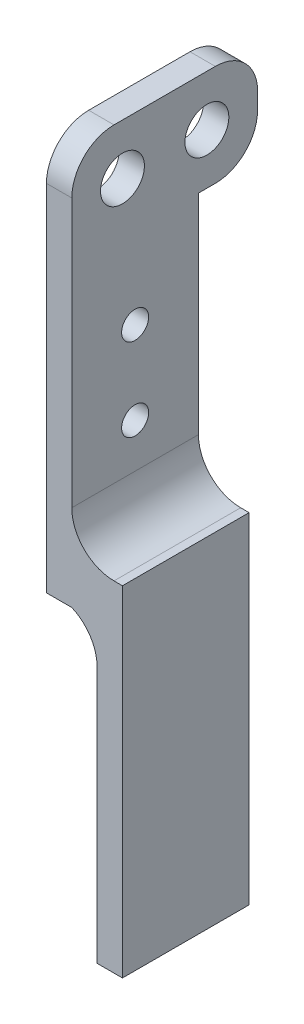
ISO-10303-21;
HEADER;
FILE_DESCRIPTION(('STEP AP214'),'2;1');
FILE_NAME('part.step','',(''),(''),'','','');
FILE_SCHEMA(('AUTOMOTIVE_DESIGN { 1 0 10303 214 1 1 1 1 }'));
ENDSEC;
DATA;
#1=APPLICATION_CONTEXT('core data for automotive mechanical design processes');
#2=APPLICATION_PROTOCOL_DEFINITION('international standard','automotive_design',2000,#1);
#3=PRODUCT_CONTEXT('',#1,'mechanical');
#4=PRODUCT('Part','Part','',(#3));
#5=PRODUCT_RELATED_PRODUCT_CATEGORY('part','',(#4));
#6=PRODUCT_DEFINITION_FORMATION('','',#4);
#7=PRODUCT_DEFINITION_CONTEXT('part definition',#1,'design');
#8=PRODUCT_DEFINITION('design','',#6,#7);
#9=PRODUCT_DEFINITION_SHAPE('','',#8);
#10=(LENGTH_UNIT() NAMED_UNIT(*) SI_UNIT(.MILLI.,.METRE.));
#11=(NAMED_UNIT(*) PLANE_ANGLE_UNIT() SI_UNIT($,.RADIAN.));
#12=(NAMED_UNIT(*) SI_UNIT($,.STERADIAN.) SOLID_ANGLE_UNIT());
#13=UNCERTAINTY_MEASURE_WITH_UNIT(LENGTH_MEASURE(1.E-05),#10,'distance_accuracy_value','');
#14=(GEOMETRIC_REPRESENTATION_CONTEXT(3) GLOBAL_UNCERTAINTY_ASSIGNED_CONTEXT((#13)) GLOBAL_UNIT_ASSIGNED_CONTEXT((#10,
#11,#12)) REPRESENTATION_CONTEXT('',''));
#15=CARTESIAN_POINT('',(0.,0.,0.));
#16=DIRECTION('',(0.,0.,1.));
#17=DIRECTION('',(1.,0.,0.));
#18=AXIS2_PLACEMENT_3D('',#15,#16,#17);
#19=CARTESIAN_POINT('',(3.,0.,0.));
#20=DIRECTION('',(-1.,0.,0.));
#21=DIRECTION('',(0.,0.,1.));
#22=AXIS2_PLACEMENT_3D('',#19,#20,#21);
#23=PLANE('',#22);
#24=CARTESIAN_POINT('',(3.,0.,-10.));
#25=DIRECTION('',(1.,0.,0.));
#26=DIRECTION('',(0.,0.,-1.));
#27=AXIS2_PLACEMENT_3D('',#24,#25,#26);
#28=CIRCLE('',#27,2.6);
#29=CARTESIAN_POINT('',(3.,0.,-12.6));
#30=VERTEX_POINT('',#29);
#31=EDGE_CURVE('E257',#30,#30,#28,.T.);
#32=ORIENTED_EDGE('',*,*,#31,.F.);
#33=EDGE_LOOP('',(#32));
#34=FACE_BOUND('',#33,.T.);
#35=CARTESIAN_POINT('',(3.,0.,0.));
#36=DIRECTION('',(1.,0.,0.));
#37=DIRECTION('',(0.,0.,-1.));
#38=AXIS2_PLACEMENT_3D('',#35,#36,#37);
#39=CIRCLE('',#38,2.6);
#40=CARTESIAN_POINT('',(3.,0.,-2.6));
#41=VERTEX_POINT('',#40);
#42=EDGE_CURVE('E251',#41,#41,#39,.T.);
#43=ORIENTED_EDGE('',*,*,#42,.F.);
#44=EDGE_LOOP('',(#43));
#45=FACE_BOUND('',#44,.T.);
#46=CARTESIAN_POINT('',(3.,-25.55,-1.5));
#47=DIRECTION('',(1.,0.,0.));
#48=DIRECTION('',(0.,0.,-1.));
#49=AXIS2_PLACEMENT_3D('',#46,#47,#48);
#50=CIRCLE('',#49,1.6);
#51=CARTESIAN_POINT('',(3.,-25.55,-3.1));
#52=VERTEX_POINT('',#51);
#53=EDGE_CURVE('E234',#52,#52,#50,.T.);
#54=ORIENTED_EDGE('',*,*,#53,.F.);
#55=EDGE_LOOP('',(#54));
#56=FACE_BOUND('',#55,.T.);
#57=CARTESIAN_POINT('',(3.,-15.75,-1.5));
#58=DIRECTION('',(1.,0.,0.));
#59=DIRECTION('',(0.,0.,-1.));
#60=AXIS2_PLACEMENT_3D('',#57,#58,#59);
#61=CIRCLE('',#60,1.6);
#62=CARTESIAN_POINT('',(3.,-15.75,-3.10000000000001));
#63=VERTEX_POINT('',#62);
#64=EDGE_CURVE('E205',#63,#63,#61,.T.);
#65=ORIENTED_EDGE('',*,*,#64,.F.);
#66=EDGE_LOOP('',(#65));
#67=FACE_BOUND('',#66,.T.);
#68=DIRECTION('',(0.,-1.,0.));
#69=VECTOR('',#68,1.);
#70=CARTESIAN_POINT('',(3.,-6.,6.));
#71=LINE('',#70,#69);
#72=CARTESIAN_POINT('',(3.,1.,6.));
#73=VERTEX_POINT('',#72);
#74=CARTESIAN_POINT('',(3.,-30.77,6.));
#75=VERTEX_POINT('',#74);
#76=EDGE_CURVE('E267',#73,#75,#71,.T.);
#77=ORIENTED_EDGE('',*,*,#76,.T.);
#78=DIRECTION('',(0.,0.,1.));
#79=VECTOR('',#78,1.);
#80=CARTESIAN_POINT('',(3.,-30.77,-9.00000000000001));
#81=LINE('',#80,#79);
#82=CARTESIAN_POINT('',(3.,-30.77,-9.00000000000001));
#83=VERTEX_POINT('',#82);
#84=EDGE_CURVE('E53',#75,#83,#81,.F.);
#85=ORIENTED_EDGE('',*,*,#84,.T.);
#86=DIRECTION('',(0.,1.,0.));
#87=VECTOR('',#86,1.);
#88=CARTESIAN_POINT('',(3.,-6.,-9.00000000000001));
#89=LINE('',#88,#87);
#90=CARTESIAN_POINT('',(3.,-6.,-9.00000000000001));
#91=VERTEX_POINT('',#90);
#92=EDGE_CURVE('E244',#83,#91,#89,.T.);
#93=ORIENTED_EDGE('',*,*,#92,.T.);
#94=DIRECTION('',(0.,0.,-1.));
#95=VECTOR('',#94,1.);
#96=CARTESIAN_POINT('',(3.,-6.,6.));
#97=LINE('',#96,#95);
#98=CARTESIAN_POINT('',(3.,-6.,-11.));
#99=VERTEX_POINT('',#98);
#100=EDGE_CURVE('E176',#91,#99,#97,.T.);
#101=ORIENTED_EDGE('',*,*,#100,.T.);
#102=CARTESIAN_POINT('',(3.,-1.,-11.));
#103=DIRECTION('',(-1.,0.,0.));
#104=DIRECTION('',(0.,0.,1.));
#105=AXIS2_PLACEMENT_3D('',#102,#103,#104);
#106=CIRCLE('',#105,5.);
#107=CARTESIAN_POINT('',(3.,-1.,-16.));
#108=VERTEX_POINT('',#107);
#109=EDGE_CURVE('E189',#99,#108,#106,.F.);
#110=ORIENTED_EDGE('',*,*,#109,.T.);
#111=DIRECTION('',(0.,1.,0.));
#112=VECTOR('',#111,1.);
#113=CARTESIAN_POINT('',(3.,-6.,-16.));
#114=LINE('',#113,#112);
#115=CARTESIAN_POINT('',(3.,1.,-16.));
#116=VERTEX_POINT('',#115);
#117=EDGE_CURVE('E167',#108,#116,#114,.T.);
#118=ORIENTED_EDGE('',*,*,#117,.T.);
#119=CARTESIAN_POINT('',(3.,1.,-11.));
#120=DIRECTION('',(-1.,0.,0.));
#121=DIRECTION('',(0.,0.,1.));
#122=AXIS2_PLACEMENT_3D('',#119,#120,#121);
#123=CIRCLE('',#122,5.);
#124=CARTESIAN_POINT('',(3.,6.,-11.));
#125=VERTEX_POINT('',#124);
#126=EDGE_CURVE('E187',#116,#125,#123,.F.);
#127=ORIENTED_EDGE('',*,*,#126,.T.);
#128=DIRECTION('',(0.,0.,1.));
#129=VECTOR('',#128,1.);
#130=CARTESIAN_POINT('',(3.,6.,6.));
#131=LINE('',#130,#129);
#132=CARTESIAN_POINT('',(3.,6.,0.999999999999996));
#133=VERTEX_POINT('',#132);
#134=EDGE_CURVE('E264',#125,#133,#131,.T.);
#135=ORIENTED_EDGE('',*,*,#134,.T.);
#136=CARTESIAN_POINT('',(3.,1.,0.999999999999996));
#137=DIRECTION('',(-1.,0.,0.));
#138=DIRECTION('',(0.,0.,1.));
#139=AXIS2_PLACEMENT_3D('',#136,#137,#138);
#140=CIRCLE('',#139,5.);
#141=EDGE_CURVE('E191',#133,#73,#140,.F.);
#142=ORIENTED_EDGE('',*,*,#141,.T.);
#143=EDGE_LOOP('',(#77,#85,#93,#101,#110,#118,#127,#135,#142));
#144=FACE_BOUND('',#143,.T.);
#145=ADVANCED_FACE('F32',(#34,#45,#56,#67,#144),#23,.F.);
#146=CARTESIAN_POINT('',(0.,0.,0.));
#147=DIRECTION('',(-1.,0.,0.));
#148=DIRECTION('',(0.,0.,1.));
#149=AXIS2_PLACEMENT_3D('',#146,#147,#148);
#150=PLANE('',#149);
#151=DIRECTION('',(0.,0.,1.));
#152=VECTOR('',#151,1.);
#153=CARTESIAN_POINT('',(0.,-41.,6.));
#154=LINE('',#153,#152);
#155=CARTESIAN_POINT('',(0.,-41.,-9.00000000000001));
#156=VERTEX_POINT('',#155);
#157=CARTESIAN_POINT('',(0.,-41.,6.));
#158=VERTEX_POINT('',#157);
#159=EDGE_CURVE('E140',#156,#158,#154,.T.);
#160=ORIENTED_EDGE('',*,*,#159,.T.);
#161=DIRECTION('',(0.,-1.,0.));
#162=VECTOR('',#161,1.);
#163=CARTESIAN_POINT('',(0.,-6.,6.));
#164=LINE('',#163,#162);
#165=CARTESIAN_POINT('',(0.,1.,6.));
#166=VERTEX_POINT('',#165);
#167=EDGE_CURVE('E154',#166,#158,#164,.T.);
#168=ORIENTED_EDGE('',*,*,#167,.F.);
#169=CARTESIAN_POINT('',(0.,1.,0.999999999999996));
#170=DIRECTION('',(-1.,0.,0.));
#171=DIRECTION('',(0.,0.,1.));
#172=AXIS2_PLACEMENT_3D('',#169,#170,#171);
#173=CIRCLE('',#172,5.);
#174=CARTESIAN_POINT('',(0.,6.,0.999999999999996));
#175=VERTEX_POINT('',#174);
#176=EDGE_CURVE('E180',#166,#175,#173,.T.);
#177=ORIENTED_EDGE('',*,*,#176,.T.);
#178=DIRECTION('',(0.,0.,1.));
#179=VECTOR('',#178,1.);
#180=CARTESIAN_POINT('',(0.,6.,6.));
#181=LINE('',#180,#179);
#182=CARTESIAN_POINT('',(0.,6.,-11.));
#183=VERTEX_POINT('',#182);
#184=EDGE_CURVE('E164',#183,#175,#181,.T.);
#185=ORIENTED_EDGE('',*,*,#184,.F.);
#186=CARTESIAN_POINT('',(0.,1.,-11.));
#187=DIRECTION('',(-1.,0.,0.));
#188=DIRECTION('',(0.,0.,1.));
#189=AXIS2_PLACEMENT_3D('',#186,#187,#188);
#190=CIRCLE('',#189,5.);
#191=CARTESIAN_POINT('',(0.,1.,-16.));
#192=VERTEX_POINT('',#191);
#193=EDGE_CURVE('E175',#183,#192,#190,.T.);
#194=ORIENTED_EDGE('',*,*,#193,.T.);
#195=DIRECTION('',(0.,1.,0.));
#196=VECTOR('',#195,1.);
#197=CARTESIAN_POINT('',(0.,-6.,-16.));
#198=LINE('',#197,#196);
#199=CARTESIAN_POINT('',(0.,-1.,-16.));
#200=VERTEX_POINT('',#199);
#201=EDGE_CURVE('E170',#200,#192,#198,.T.);
#202=ORIENTED_EDGE('',*,*,#201,.F.);
#203=CARTESIAN_POINT('',(0.,-1.,-11.));
#204=DIRECTION('',(-1.,0.,0.));
#205=DIRECTION('',(0.,0.,1.));
#206=AXIS2_PLACEMENT_3D('',#203,#204,#205);
#207=CIRCLE('',#206,5.);
#208=CARTESIAN_POINT('',(0.,-6.,-11.));
#209=VERTEX_POINT('',#208);
#210=EDGE_CURVE('E178',#200,#209,#207,.T.);
#211=ORIENTED_EDGE('',*,*,#210,.T.);
#212=DIRECTION('',(0.,0.,-1.));
#213=VECTOR('',#212,1.);
#214=CARTESIAN_POINT('',(0.,-6.,6.));
#215=LINE('',#214,#213);
#216=CARTESIAN_POINT('',(0.,-6.,-9.00000000000001));
#217=VERTEX_POINT('',#216);
#218=EDGE_CURVE('E163',#217,#209,#215,.T.);
#219=ORIENTED_EDGE('',*,*,#218,.F.);
#220=DIRECTION('',(0.,1.,0.));
#221=VECTOR('',#220,1.);
#222=CARTESIAN_POINT('',(0.,-6.,-9.00000000000001));
#223=LINE('',#222,#221);
#224=EDGE_CURVE('E156',#156,#217,#223,.T.);
#225=ORIENTED_EDGE('',*,*,#224,.F.);
#226=EDGE_LOOP('',(#160,#168,#177,#185,#194,#202,#211,#219,#225));
#227=FACE_BOUND('',#226,.T.);
#228=CARTESIAN_POINT('',(0.,-15.75,-1.5));
#229=DIRECTION('',(-1.,0.,0.));
#230=DIRECTION('',(0.,0.,1.));
#231=AXIS2_PLACEMENT_3D('',#228,#229,#230);
#232=CIRCLE('',#231,1.6);
#233=CARTESIAN_POINT('',(0.,-15.75,0.0999999999999961));
#234=VERTEX_POINT('',#233);
#235=EDGE_CURVE('E204',#234,#234,#232,.T.);
#236=ORIENTED_EDGE('',*,*,#235,.F.);
#237=EDGE_LOOP('',(#236));
#238=FACE_BOUND('',#237,.T.);
#239=CARTESIAN_POINT('',(0.,-25.55,-1.5));
#240=DIRECTION('',(-1.,0.,0.));
#241=DIRECTION('',(0.,0.,1.));
#242=AXIS2_PLACEMENT_3D('',#239,#240,#241);
#243=CIRCLE('',#242,1.6);
#244=CARTESIAN_POINT('',(0.,-25.55,0.0999999999999953));
#245=VERTEX_POINT('',#244);
#246=EDGE_CURVE('E201',#245,#245,#243,.T.);
#247=ORIENTED_EDGE('',*,*,#246,.F.);
#248=EDGE_LOOP('',(#247));
#249=FACE_BOUND('',#248,.T.);
#250=CARTESIAN_POINT('',(0.,0.,-10.));
#251=DIRECTION('',(1.,0.,0.));
#252=DIRECTION('',(0.,0.,-1.));
#253=AXIS2_PLACEMENT_3D('',#250,#251,#252);
#254=CIRCLE('',#253,2.6);
#255=CARTESIAN_POINT('',(0.,0.,-12.6));
#256=VERTEX_POINT('',#255);
#257=EDGE_CURVE('E254',#256,#256,#254,.T.);
#258=ORIENTED_EDGE('',*,*,#257,.T.);
#259=EDGE_LOOP('',(#258));
#260=FACE_BOUND('',#259,.T.);
#261=CARTESIAN_POINT('',(0.,0.,0.));
#262=DIRECTION('',(1.,0.,0.));
#263=DIRECTION('',(0.,0.,-1.));
#264=AXIS2_PLACEMENT_3D('',#261,#262,#263);
#265=CIRCLE('',#264,2.6);
#266=CARTESIAN_POINT('',(0.,0.,-2.6));
#267=VERTEX_POINT('',#266);
#268=EDGE_CURVE('E250',#267,#267,#265,.T.);
#269=ORIENTED_EDGE('',*,*,#268,.T.);
#270=EDGE_LOOP('',(#269));
#271=FACE_BOUND('',#270,.T.);
#272=ADVANCED_FACE('F152',(#227,#238,#249,#260,#271),#150,.T.);
#273=CARTESIAN_POINT('',(3.,-6.,-16.));
#274=DIRECTION('',(0.,0.,1.));
#275=DIRECTION('',(1.,0.,0.));
#276=AXIS2_PLACEMENT_3D('',#273,#274,#275);
#277=PLANE('',#276);
#278=ORIENTED_EDGE('',*,*,#117,.F.);
#279=DIRECTION('',(-1.,0.,0.));
#280=VECTOR('',#279,1.);
#281=CARTESIAN_POINT('',(3.,-1.,-16.));
#282=LINE('',#281,#280);
#283=EDGE_CURVE('E195',#108,#200,#282,.T.);
#284=ORIENTED_EDGE('',*,*,#283,.T.);
#285=ORIENTED_EDGE('',*,*,#201,.T.);
#286=DIRECTION('',(-1.,0.,0.));
#287=VECTOR('',#286,1.);
#288=CARTESIAN_POINT('',(3.,1.,-16.));
#289=LINE('',#288,#287);
#290=EDGE_CURVE('E193',#192,#116,#289,.F.);
#291=ORIENTED_EDGE('',*,*,#290,.T.);
#292=EDGE_LOOP('',(#278,#284,#285,#291));
#293=FACE_BOUND('',#292,.T.);
#294=ADVANCED_FACE('F275',(#293),#277,.F.);
#295=CARTESIAN_POINT('',(3.,6.,6.));
#296=DIRECTION('',(0.,-1.,0.));
#297=DIRECTION('',(0.,0.,-1.));
#298=AXIS2_PLACEMENT_3D('',#295,#296,#297);
#299=PLANE('',#298);
#300=ORIENTED_EDGE('',*,*,#184,.T.);
#301=DIRECTION('',(-1.,0.,0.));
#302=VECTOR('',#301,1.);
#303=CARTESIAN_POINT('',(3.,6.,0.999999999999996));
#304=LINE('',#303,#302);
#305=EDGE_CURVE('E185',#175,#133,#304,.F.);
#306=ORIENTED_EDGE('',*,*,#305,.T.);
#307=ORIENTED_EDGE('',*,*,#134,.F.);
#308=DIRECTION('',(-1.,0.,0.));
#309=VECTOR('',#308,1.);
#310=CARTESIAN_POINT('',(3.,6.,-11.));
#311=LINE('',#310,#309);
#312=EDGE_CURVE('E182',#125,#183,#311,.T.);
#313=ORIENTED_EDGE('',*,*,#312,.T.);
#314=EDGE_LOOP('',(#300,#306,#307,#313));
#315=FACE_BOUND('',#314,.T.);
#316=ADVANCED_FACE('F284',(#315),#299,.F.);
#317=CARTESIAN_POINT('',(3.,-6.,6.));
#318=DIRECTION('',(0.,0.,-1.));
#319=DIRECTION('',(-1.,0.,0.));
#320=AXIS2_PLACEMENT_3D('',#317,#318,#319);
#321=PLANE('',#320);
#322=DIRECTION('',(-1.,0.,0.));
#323=VECTOR('',#322,1.);
#324=CARTESIAN_POINT('',(3.,-41.,6.));
#325=LINE('',#324,#323);
#326=CARTESIAN_POINT('',(3.,-41.,6.));
#327=VERTEX_POINT('',#326);
#328=EDGE_CURVE('E137',#158,#327,#325,.F.);
#329=ORIENTED_EDGE('',*,*,#328,.T.);
#330=CARTESIAN_POINT('',(1.,-45.5825756949558,6.));
#331=DIRECTION('',(0.,0.,-1.));
#332=DIRECTION('',(-1.,0.,0.));
#333=AXIS2_PLACEMENT_3D('',#330,#331,#332);
#334=CIRCLE('',#333,5.);
#335=CARTESIAN_POINT('',(6.,-45.5825756949558,6.));
#336=VERTEX_POINT('',#335);
#337=EDGE_CURVE('E213',#327,#336,#334,.T.);
#338=ORIENTED_EDGE('',*,*,#337,.T.);
#339=DIRECTION('',(0.,1.,0.));
#340=VECTOR('',#339,1.);
#341=CARTESIAN_POINT('',(6.,-76.,6.));
#342=LINE('',#341,#340);
#343=CARTESIAN_POINT('',(6.,-76.,6.));
#344=VERTEX_POINT('',#343);
#345=EDGE_CURVE('E520',#344,#336,#342,.T.);
#346=ORIENTED_EDGE('',*,*,#345,.F.);
#347=DIRECTION('',(-1.,0.,0.));
#348=VECTOR('',#347,1.);
#349=CARTESIAN_POINT('',(9.,-76.,6.));
#350=LINE('',#349,#348);
#351=CARTESIAN_POINT('',(9.,-76.,6.));
#352=VERTEX_POINT('',#351);
#353=EDGE_CURVE('E536',#352,#344,#350,.T.);
#354=ORIENTED_EDGE('',*,*,#353,.F.);
#355=DIRECTION('',(0.,-1.,0.));
#356=VECTOR('',#355,1.);
#357=CARTESIAN_POINT('',(9.,-35.77,6.));
#358=LINE('',#357,#356);
#359=CARTESIAN_POINT('',(9.,-35.77,6.));
#360=VERTEX_POINT('',#359);
#361=EDGE_CURVE('E231',#360,#352,#358,.T.);
#362=ORIENTED_EDGE('',*,*,#361,.F.);
#363=DIRECTION('',(-1.,0.,0.));
#364=VECTOR('',#363,1.);
#365=CARTESIAN_POINT('',(9.,-35.77,6.));
#366=LINE('',#365,#364);
#367=CARTESIAN_POINT('',(8.,-35.77,6.));
#368=VERTEX_POINT('',#367);
#369=EDGE_CURVE('E224',#360,#368,#366,.T.);
#370=ORIENTED_EDGE('',*,*,#369,.T.);
#371=CARTESIAN_POINT('',(8.,-30.77,6.));
#372=DIRECTION('',(0.,0.,-1.));
#373=DIRECTION('',(-1.,0.,0.));
#374=AXIS2_PLACEMENT_3D('',#371,#372,#373);
#375=CIRCLE('',#374,5.);
#376=EDGE_CURVE('E40',#368,#75,#375,.T.);
#377=ORIENTED_EDGE('',*,*,#376,.T.);
#378=ORIENTED_EDGE('',*,*,#76,.F.);
#379=DIRECTION('',(-1.,0.,0.));
#380=VECTOR('',#379,1.);
#381=CARTESIAN_POINT('',(3.,1.,6.));
#382=LINE('',#381,#380);
#383=EDGE_CURVE('E162',#73,#166,#382,.T.);
#384=ORIENTED_EDGE('',*,*,#383,.T.);
#385=ORIENTED_EDGE('',*,*,#167,.T.);
#386=EDGE_LOOP('',(#329,#338,#346,#354,#362,#370,#377,#378,#384,#385));
#387=FACE_BOUND('',#386,.T.);
#388=ADVANCED_FACE('F160',(#387),#321,.F.);
#389=CARTESIAN_POINT('',(3.,-6.,6.));
#390=DIRECTION('',(0.,1.,0.));
#391=DIRECTION('',(0.,0.,1.));
#392=AXIS2_PLACEMENT_3D('',#389,#390,#391);
#393=PLANE('',#392);
#394=ORIENTED_EDGE('',*,*,#218,.T.);
#395=DIRECTION('',(-1.,0.,0.));
#396=VECTOR('',#395,1.);
#397=CARTESIAN_POINT('',(3.,-6.,-11.));
#398=LINE('',#397,#396);
#399=EDGE_CURVE('E147',#209,#99,#398,.F.);
#400=ORIENTED_EDGE('',*,*,#399,.T.);
#401=ORIENTED_EDGE('',*,*,#100,.F.);
#402=DIRECTION('',(-1.,0.,0.));
#403=VECTOR('',#402,1.);
#404=CARTESIAN_POINT('',(3.,-6.,-9.00000000000001));
#405=LINE('',#404,#403);
#406=EDGE_CURVE('E246',#91,#217,#405,.T.);
#407=ORIENTED_EDGE('',*,*,#406,.T.);
#408=EDGE_LOOP('',(#394,#400,#401,#407));
#409=FACE_BOUND('',#408,.T.);
#410=ADVANCED_FACE('F298',(#409),#393,.F.);
#411=CARTESIAN_POINT('',(3.,0.,-10.));
#412=DIRECTION('',(-1.,0.,0.));
#413=DIRECTION('',(0.,0.,1.));
#414=AXIS2_PLACEMENT_3D('',#411,#412,#413);
#415=CYLINDRICAL_SURFACE('',#414,2.6);
#416=ORIENTED_EDGE('',*,*,#31,.T.);
#417=EDGE_LOOP('',(#416));
#418=FACE_BOUND('',#417,.T.);
#419=ORIENTED_EDGE('',*,*,#257,.F.);
#420=EDGE_LOOP('',(#419));
#421=FACE_BOUND('',#420,.T.);
#422=ADVANCED_FACE('F300',(#418,#421),#415,.F.);
#423=CARTESIAN_POINT('',(3.,0.,0.));
#424=DIRECTION('',(-1.,0.,0.));
#425=DIRECTION('',(0.,0.,1.));
#426=AXIS2_PLACEMENT_3D('',#423,#424,#425);
#427=CYLINDRICAL_SURFACE('',#426,2.6);
#428=ORIENTED_EDGE('',*,*,#42,.T.);
#429=EDGE_LOOP('',(#428));
#430=FACE_BOUND('',#429,.T.);
#431=ORIENTED_EDGE('',*,*,#268,.F.);
#432=EDGE_LOOP('',(#431));
#433=FACE_BOUND('',#432,.T.);
#434=ADVANCED_FACE('F306',(#430,#433),#427,.F.);
#435=CARTESIAN_POINT('',(3.,-6.,-9.00000000000001));
#436=DIRECTION('',(0.,0.,1.));
#437=DIRECTION('',(0.,-1.,0.));
#438=AXIS2_PLACEMENT_3D('',#435,#436,#437);
#439=PLANE('',#438);
#440=ORIENTED_EDGE('',*,*,#92,.F.);
#441=CARTESIAN_POINT('',(8.,-30.77,-9.00000000000001));
#442=DIRECTION('',(0.,0.,1.));
#443=DIRECTION('',(0.,-1.,0.));
#444=AXIS2_PLACEMENT_3D('',#441,#442,#443);
#445=CIRCLE('',#444,5.);
#446=CARTESIAN_POINT('',(8.,-35.77,-9.00000000000001));
#447=VERTEX_POINT('',#446);
#448=EDGE_CURVE('E11',#83,#447,#445,.T.);
#449=ORIENTED_EDGE('',*,*,#448,.T.);
#450=DIRECTION('',(-1.,0.,0.));
#451=VECTOR('',#450,1.);
#452=CARTESIAN_POINT('',(9.,-35.77,-9.00000000000001));
#453=LINE('',#452,#451);
#454=CARTESIAN_POINT('',(9.,-35.77,-9.00000000000001));
#455=VERTEX_POINT('',#454);
#456=EDGE_CURVE('E227',#455,#447,#453,.T.);
#457=ORIENTED_EDGE('',*,*,#456,.F.);
#458=DIRECTION('',(0.,1.,0.));
#459=VECTOR('',#458,1.);
#460=CARTESIAN_POINT('',(9.,-35.77,-9.00000000000001));
#461=LINE('',#460,#459);
#462=CARTESIAN_POINT('',(9.,-76.,-9.00000000000001));
#463=VERTEX_POINT('',#462);
#464=EDGE_CURVE('E236',#463,#455,#461,.T.);
#465=ORIENTED_EDGE('',*,*,#464,.F.);
#466=DIRECTION('',(1.,0.,0.));
#467=VECTOR('',#466,1.);
#468=CARTESIAN_POINT('',(9.,-76.,-9.00000000000001));
#469=LINE('',#468,#467);
#470=CARTESIAN_POINT('',(6.,-76.,-9.00000000000001));
#471=VERTEX_POINT('',#470);
#472=EDGE_CURVE('E527',#471,#463,#469,.T.);
#473=ORIENTED_EDGE('',*,*,#472,.F.);
#474=DIRECTION('',(0.,1.,0.));
#475=VECTOR('',#474,1.);
#476=CARTESIAN_POINT('',(6.,-76.,-9.00000000000001));
#477=LINE('',#476,#475);
#478=CARTESIAN_POINT('',(6.,-45.5825756949558,-9.00000000000001));
#479=VERTEX_POINT('',#478);
#480=EDGE_CURVE('E525',#471,#479,#477,.T.);
#481=ORIENTED_EDGE('',*,*,#480,.T.);
#482=CARTESIAN_POINT('',(1.,-45.5825756949558,-9.00000000000001));
#483=DIRECTION('',(0.,0.,1.));
#484=DIRECTION('',(0.,-1.,0.));
#485=AXIS2_PLACEMENT_3D('',#482,#483,#484);
#486=CIRCLE('',#485,5.);
#487=CARTESIAN_POINT('',(3.,-41.,-9.00000000000001));
#488=VERTEX_POINT('',#487);
#489=EDGE_CURVE('E210',#479,#488,#486,.T.);
#490=ORIENTED_EDGE('',*,*,#489,.T.);
#491=DIRECTION('',(-1.,0.,0.));
#492=VECTOR('',#491,1.);
#493=CARTESIAN_POINT('',(3.,-41.,-9.00000000000001));
#494=LINE('',#493,#492);
#495=EDGE_CURVE('E146',#488,#156,#494,.T.);
#496=ORIENTED_EDGE('',*,*,#495,.T.);
#497=ORIENTED_EDGE('',*,*,#224,.T.);
#498=ORIENTED_EDGE('',*,*,#406,.F.);
#499=EDGE_LOOP('',(#440,#449,#457,#465,#473,#481,#490,#496,#497,#498));
#500=FACE_BOUND('',#499,.T.);
#501=ADVANCED_FACE('F290',(#500),#439,.F.);
#502=CARTESIAN_POINT('',(3.,1.,0.999999999999996));
#503=DIRECTION('',(-1.,0.,0.));
#504=DIRECTION('',(0.,0.,1.));
#505=AXIS2_PLACEMENT_3D('',#502,#503,#504);
#506=CYLINDRICAL_SURFACE('',#505,5.);
#507=ORIENTED_EDGE('',*,*,#141,.F.);
#508=ORIENTED_EDGE('',*,*,#305,.F.);
#509=ORIENTED_EDGE('',*,*,#176,.F.);
#510=ORIENTED_EDGE('',*,*,#383,.F.);
#511=EDGE_LOOP('',(#507,#508,#509,#510));
#512=FACE_BOUND('',#511,.T.);
#513=ADVANCED_FACE('F288',(#512),#506,.T.);
#514=CARTESIAN_POINT('',(3.,-1.,-11.));
#515=DIRECTION('',(-1.,0.,0.));
#516=DIRECTION('',(0.,0.,1.));
#517=AXIS2_PLACEMENT_3D('',#514,#515,#516);
#518=CYLINDRICAL_SURFACE('',#517,5.);
#519=ORIENTED_EDGE('',*,*,#109,.F.);
#520=ORIENTED_EDGE('',*,*,#399,.F.);
#521=ORIENTED_EDGE('',*,*,#210,.F.);
#522=ORIENTED_EDGE('',*,*,#283,.F.);
#523=EDGE_LOOP('',(#519,#520,#521,#522));
#524=FACE_BOUND('',#523,.T.);
#525=ADVANCED_FACE('F297',(#524),#518,.T.);
#526=CARTESIAN_POINT('',(3.,1.,-11.));
#527=DIRECTION('',(-1.,0.,0.));
#528=DIRECTION('',(0.,0.,1.));
#529=AXIS2_PLACEMENT_3D('',#526,#527,#528);
#530=CYLINDRICAL_SURFACE('',#529,5.);
#531=ORIENTED_EDGE('',*,*,#126,.F.);
#532=ORIENTED_EDGE('',*,*,#290,.F.);
#533=ORIENTED_EDGE('',*,*,#193,.F.);
#534=ORIENTED_EDGE('',*,*,#312,.F.);
#535=EDGE_LOOP('',(#531,#532,#533,#534));
#536=FACE_BOUND('',#535,.T.);
#537=ADVANCED_FACE('F279',(#536),#530,.T.);
#538=CARTESIAN_POINT('',(-7.,-25.55,-1.5));
#539=DIRECTION('',(1.,0.,0.));
#540=DIRECTION('',(0.,0.,-1.));
#541=AXIS2_PLACEMENT_3D('',#538,#539,#540);
#542=CYLINDRICAL_SURFACE('',#541,1.6);
#543=ORIENTED_EDGE('',*,*,#246,.T.);
#544=EDGE_LOOP('',(#543));
#545=FACE_BOUND('',#544,.T.);
#546=ORIENTED_EDGE('',*,*,#53,.T.);
#547=EDGE_LOOP('',(#546));
#548=FACE_BOUND('',#547,.T.);
#549=ADVANCED_FACE('F325',(#545,#548),#542,.F.);
#550=CARTESIAN_POINT('',(-7.,-15.75,-1.5));
#551=DIRECTION('',(1.,0.,0.));
#552=DIRECTION('',(0.,0.,-1.));
#553=AXIS2_PLACEMENT_3D('',#550,#551,#552);
#554=CYLINDRICAL_SURFACE('',#553,1.6);
#555=ORIENTED_EDGE('',*,*,#235,.T.);
#556=EDGE_LOOP('',(#555));
#557=FACE_BOUND('',#556,.T.);
#558=ORIENTED_EDGE('',*,*,#64,.T.);
#559=EDGE_LOOP('',(#558));
#560=FACE_BOUND('',#559,.T.);
#561=ADVANCED_FACE('F328',(#557,#560),#554,.F.);
#562=CARTESIAN_POINT('',(9.,-35.77,6.));
#563=DIRECTION('',(0.,-1.,0.));
#564=DIRECTION('',(0.,0.,-1.));
#565=AXIS2_PLACEMENT_3D('',#562,#563,#564);
#566=PLANE('',#565);
#567=ORIENTED_EDGE('',*,*,#456,.T.);
#568=DIRECTION('',(0.,0.,1.));
#569=VECTOR('',#568,1.);
#570=CARTESIAN_POINT('',(8.,-35.77,6.));
#571=LINE('',#570,#569);
#572=EDGE_CURVE('E215',#447,#368,#571,.T.);
#573=ORIENTED_EDGE('',*,*,#572,.T.);
#574=ORIENTED_EDGE('',*,*,#369,.F.);
#575=DIRECTION('',(0.,0.,1.));
#576=VECTOR('',#575,1.);
#577=CARTESIAN_POINT('',(9.,-35.77,6.));
#578=LINE('',#577,#576);
#579=EDGE_CURVE('E232',#455,#360,#578,.T.);
#580=ORIENTED_EDGE('',*,*,#579,.F.);
#581=EDGE_LOOP('',(#567,#573,#574,#580));
#582=FACE_BOUND('',#581,.T.);
#583=ADVANCED_FACE('F222',(#582),#566,.F.);
#584=CARTESIAN_POINT('',(9.,0.,0.));
#585=DIRECTION('',(1.,0.,0.));
#586=DIRECTION('',(0.,0.,-1.));
#587=AXIS2_PLACEMENT_3D('',#584,#585,#586);
#588=PLANE('',#587);
#589=ORIENTED_EDGE('',*,*,#361,.T.);
#590=DIRECTION('',(0.,0.,1.));
#591=VECTOR('',#590,1.);
#592=CARTESIAN_POINT('',(9.,-76.,6.));
#593=LINE('',#592,#591);
#594=EDGE_CURVE('E157',#463,#352,#593,.T.);
#595=ORIENTED_EDGE('',*,*,#594,.F.);
#596=ORIENTED_EDGE('',*,*,#464,.T.);
#597=ORIENTED_EDGE('',*,*,#579,.T.);
#598=EDGE_LOOP('',(#589,#595,#596,#597));
#599=FACE_BOUND('',#598,.T.);
#600=ADVANCED_FACE('F335',(#599),#588,.T.);
#601=CARTESIAN_POINT('',(6.,-76.,6.));
#602=DIRECTION('',(1.,0.,0.));
#603=DIRECTION('',(0.,0.,-1.));
#604=AXIS2_PLACEMENT_3D('',#601,#602,#603);
#605=PLANE('',#604);
#606=ORIENTED_EDGE('',*,*,#345,.T.);
#607=DIRECTION('',(0.,0.,1.));
#608=VECTOR('',#607,1.);
#609=CARTESIAN_POINT('',(6.,-45.5825756949558,6.));
#610=LINE('',#609,#608);
#611=EDGE_CURVE('E200',#336,#479,#610,.F.);
#612=ORIENTED_EDGE('',*,*,#611,.T.);
#613=ORIENTED_EDGE('',*,*,#480,.F.);
#614=DIRECTION('',(0.,0.,-1.));
#615=VECTOR('',#614,1.);
#616=CARTESIAN_POINT('',(6.,-76.,6.));
#617=LINE('',#616,#615);
#618=EDGE_CURVE('E524',#344,#471,#617,.T.);
#619=ORIENTED_EDGE('',*,*,#618,.F.);
#620=EDGE_LOOP('',(#606,#612,#613,#619));
#621=FACE_BOUND('',#620,.T.);
#622=ADVANCED_FACE('F338',(#621),#605,.F.);
#623=CARTESIAN_POINT('',(0.,-76.,0.));
#624=DIRECTION('',(0.,1.,0.));
#625=DIRECTION('',(0.,0.,1.));
#626=AXIS2_PLACEMENT_3D('',#623,#624,#625);
#627=PLANE('',#626);
#628=ORIENTED_EDGE('',*,*,#594,.T.);
#629=ORIENTED_EDGE('',*,*,#353,.T.);
#630=ORIENTED_EDGE('',*,*,#618,.T.);
#631=ORIENTED_EDGE('',*,*,#472,.T.);
#632=EDGE_LOOP('',(#628,#629,#630,#631));
#633=FACE_BOUND('',#632,.T.);
#634=ADVANCED_FACE('F342',(#633),#627,.F.);
#635=CARTESIAN_POINT('',(1.,-45.5825756949558,6.));
#636=DIRECTION('',(0.,0.,1.));
#637=DIRECTION('',(1.,0.,0.));
#638=AXIS2_PLACEMENT_3D('',#635,#636,#637);
#639=CYLINDRICAL_SURFACE('',#638,5.);
#640=ORIENTED_EDGE('',*,*,#337,.F.);
#641=DIRECTION('',(0.,0.,-1.));
#642=VECTOR('',#641,1.);
#643=CARTESIAN_POINT('',(3.,-41.,6.));
#644=LINE('',#643,#642);
#645=EDGE_CURVE('E143',#327,#488,#644,.T.);
#646=ORIENTED_EDGE('',*,*,#645,.T.);
#647=ORIENTED_EDGE('',*,*,#489,.F.);
#648=ORIENTED_EDGE('',*,*,#611,.F.);
#649=EDGE_LOOP('',(#640,#646,#647,#648));
#650=FACE_BOUND('',#649,.T.);
#651=ADVANCED_FACE('F346',(#650),#639,.F.);
#652=CARTESIAN_POINT('',(8.,-30.77,6.));
#653=DIRECTION('',(0.,0.,-1.));
#654=DIRECTION('',(-1.,0.,0.));
#655=AXIS2_PLACEMENT_3D('',#652,#653,#654);
#656=CYLINDRICAL_SURFACE('',#655,5.);
#657=ORIENTED_EDGE('',*,*,#448,.F.);
#658=ORIENTED_EDGE('',*,*,#84,.F.);
#659=ORIENTED_EDGE('',*,*,#376,.F.);
#660=ORIENTED_EDGE('',*,*,#572,.F.);
#661=EDGE_LOOP('',(#657,#658,#659,#660));
#662=FACE_BOUND('',#661,.T.);
#663=ADVANCED_FACE('F34',(#662),#656,.F.);
#664=CARTESIAN_POINT('',(0.,-41.,6.));
#665=DIRECTION('',(0.,1.,0.));
#666=DIRECTION('',(0.,0.,1.));
#667=AXIS2_PLACEMENT_3D('',#664,#665,#666);
#668=PLANE('',#667);
#669=ORIENTED_EDGE('',*,*,#495,.F.);
#670=ORIENTED_EDGE('',*,*,#645,.F.);
#671=ORIENTED_EDGE('',*,*,#328,.F.);
#672=ORIENTED_EDGE('',*,*,#159,.F.);
#673=EDGE_LOOP('',(#669,#670,#671,#672));
#674=FACE_BOUND('',#673,.T.);
#675=ADVANCED_FACE('F139',(#674),#668,.F.);
#676=CLOSED_SHELL('',(#145,#272,#294,#316,#388,#410,#422,#434,#501,#513,#525,#537,#549,#561,
#583,#600,#622,#634,#651,#663,#675));
#677=MANIFOLD_SOLID_BREP('B2',#676);
#678=ADVANCED_BREP_SHAPE_REPRESENTATION('',(#18,#677),#14);
#679=SHAPE_DEFINITION_REPRESENTATION(#9,#678);
ENDSEC;
END-ISO-10303-21;
